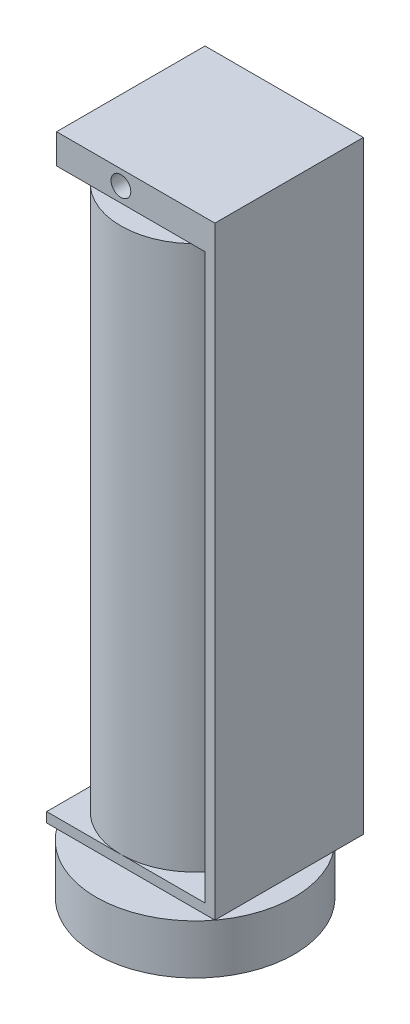
ISO-10303-21;
HEADER;
FILE_DESCRIPTION(('STEP AP214'),'2;1');
FILE_NAME('part.step','',(''),(''),'','','');
FILE_SCHEMA(('AUTOMOTIVE_DESIGN { 1 0 10303 214 1 1 1 1 }'));
ENDSEC;
DATA;
#1=APPLICATION_CONTEXT('core data for automotive mechanical design processes');
#2=APPLICATION_PROTOCOL_DEFINITION('international standard','automotive_design',2000,#1);
#3=PRODUCT_CONTEXT('',#1,'mechanical');
#4=PRODUCT('Part','Part','',(#3));
#5=PRODUCT_RELATED_PRODUCT_CATEGORY('part','',(#4));
#6=PRODUCT_DEFINITION_FORMATION('','',#4);
#7=PRODUCT_DEFINITION_CONTEXT('part definition',#1,'design');
#8=PRODUCT_DEFINITION('design','',#6,#7);
#9=PRODUCT_DEFINITION_SHAPE('','',#8);
#10=(LENGTH_UNIT() NAMED_UNIT(*) SI_UNIT(.MILLI.,.METRE.));
#11=(NAMED_UNIT(*) PLANE_ANGLE_UNIT() SI_UNIT($,.RADIAN.));
#12=(NAMED_UNIT(*) SI_UNIT($,.STERADIAN.) SOLID_ANGLE_UNIT());
#13=UNCERTAINTY_MEASURE_WITH_UNIT(LENGTH_MEASURE(1.E-05),#10,'distance_accuracy_value','');
#14=(GEOMETRIC_REPRESENTATION_CONTEXT(3) GLOBAL_UNCERTAINTY_ASSIGNED_CONTEXT((#13)) GLOBAL_UNIT_ASSIGNED_CONTEXT((#10,
#11,#12)) REPRESENTATION_CONTEXT('',''));
#15=CARTESIAN_POINT('',(0.,0.,0.));
#16=DIRECTION('',(0.,0.,1.));
#17=DIRECTION('',(1.,0.,0.));
#18=AXIS2_PLACEMENT_3D('',#15,#16,#17);
#19=CARTESIAN_POINT('',(17.,135.,-15.));
#20=DIRECTION('',(1.,0.,0.));
#21=DIRECTION('',(0.,0.,-1.));
#22=AXIS2_PLACEMENT_3D('',#19,#20,#21);
#23=PLANE('',#22);
#24=DIRECTION('',(0.,0.,1.));
#25=VECTOR('',#24,1.);
#26=CARTESIAN_POINT('',(17.,129.,-15.));
#27=LINE('',#26,#25);
#28=CARTESIAN_POINT('',(17.,129.,-15.));
#29=VERTEX_POINT('',#28);
#30=CARTESIAN_POINT('',(17.,129.,15.));
#31=VERTEX_POINT('',#30);
#32=EDGE_CURVE('E132',#29,#31,#27,.T.);
#33=ORIENTED_EDGE('',*,*,#32,.F.);
#34=DIRECTION('',(0.,-1.,0.));
#35=VECTOR('',#34,1.);
#36=CARTESIAN_POINT('',(17.,135.,-15.));
#37=LINE('',#36,#35);
#38=CARTESIAN_POINT('',(17.,15.,-15.));
#39=VERTEX_POINT('',#38);
#40=EDGE_CURVE('E138',#29,#39,#37,.T.);
#41=ORIENTED_EDGE('',*,*,#40,.T.);
#42=DIRECTION('',(0.,0.,1.));
#43=VECTOR('',#42,1.);
#44=CARTESIAN_POINT('',(17.,15.,-15.));
#45=LINE('',#44,#43);
#46=CARTESIAN_POINT('',(17.,15.,15.));
#47=VERTEX_POINT('',#46);
#48=EDGE_CURVE('E139',#39,#47,#45,.T.);
#49=ORIENTED_EDGE('',*,*,#48,.T.);
#50=DIRECTION('',(0.,-1.,0.));
#51=VECTOR('',#50,1.);
#52=CARTESIAN_POINT('',(17.,135.,15.));
#53=LINE('',#52,#51);
#54=EDGE_CURVE('E52',#31,#47,#53,.T.);
#55=ORIENTED_EDGE('',*,*,#54,.F.);
#56=EDGE_LOOP('',(#33,#41,#49,#55));
#57=FACE_BOUND('',#56,.T.);
#58=ADVANCED_FACE('F35',(#57),#23,.F.);
#59=CARTESIAN_POINT('',(-15.,15.,-15.));
#60=DIRECTION('',(0.,-1.,0.));
#61=DIRECTION('',(0.,0.,-1.));
#62=AXIS2_PLACEMENT_3D('',#59,#60,#61);
#63=PLANE('',#62);
#64=ORIENTED_EDGE('',*,*,#48,.F.);
#65=DIRECTION('',(1.,0.,0.));
#66=VECTOR('',#65,1.);
#67=CARTESIAN_POINT('',(-15.,15.,-15.));
#68=LINE('',#67,#66);
#69=CARTESIAN_POINT('',(0.,15.,-15.));
#70=VERTEX_POINT('',#69);
#71=EDGE_CURVE('E168',#70,#39,#68,.T.);
#72=ORIENTED_EDGE('',*,*,#71,.F.);
#73=CARTESIAN_POINT('',(0.,15.,0.));
#74=DIRECTION('',(0.,1.,0.));
#75=DIRECTION('',(0.,0.,1.));
#76=AXIS2_PLACEMENT_3D('',#73,#74,#75);
#77=CIRCLE('',#76,15.);
#78=CARTESIAN_POINT('',(0.,15.,15.));
#79=VERTEX_POINT('',#78);
#80=EDGE_CURVE('E185',#79,#70,#77,.T.);
#81=ORIENTED_EDGE('',*,*,#80,.F.);
#82=DIRECTION('',(-1.,0.,0.));
#83=VECTOR('',#82,1.);
#84=CARTESIAN_POINT('',(-15.,15.,15.));
#85=LINE('',#84,#83);
#86=EDGE_CURVE('E160',#47,#79,#85,.T.);
#87=ORIENTED_EDGE('',*,*,#86,.F.);
#88=EDGE_LOOP('',(#64,#72,#81,#87));
#89=FACE_BOUND('',#88,.T.);
#90=ADVANCED_FACE('F209',(#89),#63,.F.);
#91=CARTESIAN_POINT('',(0.,10.,0.));
#92=DIRECTION('',(0.,1.,0.));
#93=DIRECTION('',(0.,0.,1.));
#94=AXIS2_PLACEMENT_3D('',#91,#92,#93);
#95=PLANE('',#94);
#96=CARTESIAN_POINT('',(0.,10.,0.));
#97=DIRECTION('',(0.,1.,0.));
#98=DIRECTION('',(0.,0.,1.));
#99=AXIS2_PLACEMENT_3D('',#96,#97,#98);
#100=CIRCLE('',#99,20.);
#101=CARTESIAN_POINT('',(0.,10.,20.));
#102=VERTEX_POINT('',#101);
#103=EDGE_CURVE('E11',#102,#102,#100,.T.);
#104=ORIENTED_EDGE('',*,*,#103,.T.);
#105=EDGE_LOOP('',(#104));
#106=FACE_BOUND('',#105,.T.);
#107=CARTESIAN_POINT('',(0.,10.,0.));
#108=DIRECTION('',(0.,1.,0.));
#109=DIRECTION('',(0.,0.,1.));
#110=AXIS2_PLACEMENT_3D('',#107,#108,#109);
#111=CIRCLE('',#110,2.);
#112=CARTESIAN_POINT('',(0.,10.,2.));
#113=VERTEX_POINT('',#112);
#114=EDGE_CURVE('E184',#113,#113,#111,.T.);
#115=ORIENTED_EDGE('',*,*,#114,.F.);
#116=EDGE_LOOP('',(#115));
#117=FACE_BOUND('',#116,.T.);
#118=ADVANCED_FACE('F205',(#106,#117),#95,.T.);
#119=CARTESIAN_POINT('',(0.,10.,0.));
#120=DIRECTION('',(0.,-1.,0.));
#121=DIRECTION('',(0.,0.,-1.));
#122=AXIS2_PLACEMENT_3D('',#119,#120,#121);
#123=CYLINDRICAL_SURFACE('',#122,20.);
#124=ORIENTED_EDGE('',*,*,#103,.F.);
#125=EDGE_LOOP('',(#124));
#126=FACE_BOUND('',#125,.T.);
#127=CARTESIAN_POINT('',(0.,0.,0.));
#128=DIRECTION('',(0.,1.,0.));
#129=DIRECTION('',(0.,0.,1.));
#130=AXIS2_PLACEMENT_3D('',#127,#128,#129);
#131=CIRCLE('',#130,20.);
#132=CARTESIAN_POINT('',(0.,0.,20.));
#133=VERTEX_POINT('',#132);
#134=EDGE_CURVE('E44',#133,#133,#131,.T.);
#135=ORIENTED_EDGE('',*,*,#134,.T.);
#136=EDGE_LOOP('',(#135));
#137=FACE_BOUND('',#136,.T.);
#138=ADVANCED_FACE('F37',(#126,#137),#123,.T.);
#139=CARTESIAN_POINT('',(0.,0.,0.));
#140=DIRECTION('',(0.,1.,0.));
#141=DIRECTION('',(0.,0.,1.));
#142=AXIS2_PLACEMENT_3D('',#139,#140,#141);
#143=PLANE('',#142);
#144=ORIENTED_EDGE('',*,*,#134,.F.);
#145=EDGE_LOOP('',(#144));
#146=FACE_BOUND('',#145,.T.);
#147=ADVANCED_FACE('F195',(#146),#143,.F.);
#148=CARTESIAN_POINT('',(0.,15.,0.));
#149=DIRECTION('',(0.,-1.,0.));
#150=DIRECTION('',(0.,0.,-1.));
#151=AXIS2_PLACEMENT_3D('',#148,#149,#150);
#152=CYLINDRICAL_SURFACE('',#151,2.);
#153=CARTESIAN_POINT('',(0.,13.,0.));
#154=DIRECTION('',(0.,-1.,0.));
#155=DIRECTION('',(0.,0.,-1.));
#156=AXIS2_PLACEMENT_3D('',#153,#154,#155);
#157=CIRCLE('',#156,2.);
#158=CARTESIAN_POINT('',(0.,13.,-2.));
#159=VERTEX_POINT('',#158);
#160=EDGE_CURVE('E39',#159,#159,#157,.T.);
#161=ORIENTED_EDGE('',*,*,#160,.T.);
#162=EDGE_LOOP('',(#161));
#163=FACE_BOUND('',#162,.T.);
#164=ORIENTED_EDGE('',*,*,#114,.T.);
#165=EDGE_LOOP('',(#164));
#166=FACE_BOUND('',#165,.T.);
#167=ADVANCED_FACE('F197',(#163,#166),#152,.T.);
#168=CARTESIAN_POINT('',(-15.,13.,-15.));
#169=DIRECTION('',(0.,-1.,0.));
#170=DIRECTION('',(0.,0.,-1.));
#171=AXIS2_PLACEMENT_3D('',#168,#169,#170);
#172=PLANE('',#171);
#173=DIRECTION('',(0.,0.,-1.));
#174=VECTOR('',#173,1.);
#175=CARTESIAN_POINT('',(-15.,13.,15.));
#176=LINE('',#175,#174);
#177=CARTESIAN_POINT('',(-15.,13.,15.));
#178=VERTEX_POINT('',#177);
#179=CARTESIAN_POINT('',(-15.,13.,-15.));
#180=VERTEX_POINT('',#179);
#181=EDGE_CURVE('E156',#178,#180,#176,.T.);
#182=ORIENTED_EDGE('',*,*,#181,.T.);
#183=DIRECTION('',(1.,0.,0.));
#184=VECTOR('',#183,1.);
#185=CARTESIAN_POINT('',(-15.,13.,-15.));
#186=LINE('',#185,#184);
#187=CARTESIAN_POINT('',(19.,13.,-15.));
#188=VERTEX_POINT('',#187);
#189=EDGE_CURVE('E159',#180,#188,#186,.T.);
#190=ORIENTED_EDGE('',*,*,#189,.T.);
#191=DIRECTION('',(0.,0.,1.));
#192=VECTOR('',#191,1.);
#193=CARTESIAN_POINT('',(19.,13.,15.));
#194=LINE('',#193,#192);
#195=CARTESIAN_POINT('',(19.,13.,15.));
#196=VERTEX_POINT('',#195);
#197=EDGE_CURVE('E162',#188,#196,#194,.T.);
#198=ORIENTED_EDGE('',*,*,#197,.T.);
#199=DIRECTION('',(-1.,0.,0.));
#200=VECTOR('',#199,1.);
#201=CARTESIAN_POINT('',(-15.,13.,15.));
#202=LINE('',#201,#200);
#203=EDGE_CURVE('E164',#196,#178,#202,.T.);
#204=ORIENTED_EDGE('',*,*,#203,.T.);
#205=EDGE_LOOP('',(#182,#190,#198,#204));
#206=FACE_BOUND('',#205,.T.);
#207=ORIENTED_EDGE('',*,*,#160,.F.);
#208=EDGE_LOOP('',(#207));
#209=FACE_BOUND('',#208,.T.);
#210=ADVANCED_FACE('F202',(#206,#209),#172,.T.);
#211=CARTESIAN_POINT('',(-15.,15.,15.));
#212=VERTEX_POINT('',#211);
#213=EDGE_CURVE('E171',#79,#212,#85,.T.);
#214=ORIENTED_EDGE('',*,*,#213,.F.);
#215=CARTESIAN_POINT('',(-15.,15.,0.));
#216=VERTEX_POINT('',#215);
#217=EDGE_CURVE('E189',#216,#79,#77,.T.);
#218=ORIENTED_EDGE('',*,*,#217,.F.);
#219=DIRECTION('',(0.,0.,-1.));
#220=VECTOR('',#219,1.);
#221=CARTESIAN_POINT('',(-15.,15.,15.));
#222=LINE('',#221,#220);
#223=EDGE_CURVE('E60',#212,#216,#222,.T.);
#224=ORIENTED_EDGE('',*,*,#223,.F.);
#225=EDGE_LOOP('',(#214,#218,#224));
#226=FACE_BOUND('',#225,.T.);
#227=ADVANCED_FACE('F217',(#226),#63,.F.);
#228=CARTESIAN_POINT('',(-15.,15.,-15.));
#229=VERTEX_POINT('',#228);
#230=EDGE_CURVE('E155',#216,#229,#222,.T.);
#231=ORIENTED_EDGE('',*,*,#230,.F.);
#232=EDGE_CURVE('E188',#70,#216,#77,.T.);
#233=ORIENTED_EDGE('',*,*,#232,.F.);
#234=EDGE_CURVE('E169',#229,#70,#68,.T.);
#235=ORIENTED_EDGE('',*,*,#234,.F.);
#236=EDGE_LOOP('',(#231,#233,#235));
#237=FACE_BOUND('',#236,.T.);
#238=ADVANCED_FACE('F218',(#237),#63,.F.);
#239=CARTESIAN_POINT('',(-15.,13.,15.));
#240=DIRECTION('',(1.,0.,0.));
#241=DIRECTION('',(0.,0.,-1.));
#242=AXIS2_PLACEMENT_3D('',#239,#240,#241);
#243=PLANE('',#242);
#244=ORIENTED_EDGE('',*,*,#223,.T.);
#245=ORIENTED_EDGE('',*,*,#230,.T.);
#246=DIRECTION('',(0.,1.,0.));
#247=VECTOR('',#246,1.);
#248=CARTESIAN_POINT('',(-15.,13.,-15.));
#249=LINE('',#248,#247);
#250=EDGE_CURVE('E178',#180,#229,#249,.T.);
#251=ORIENTED_EDGE('',*,*,#250,.F.);
#252=ORIENTED_EDGE('',*,*,#181,.F.);
#253=DIRECTION('',(0.,1.,0.));
#254=VECTOR('',#253,1.);
#255=CARTESIAN_POINT('',(-15.,13.,15.));
#256=LINE('',#255,#254);
#257=EDGE_CURVE('E166',#178,#212,#256,.T.);
#258=ORIENTED_EDGE('',*,*,#257,.T.);
#259=EDGE_LOOP('',(#244,#245,#251,#252,#258));
#260=FACE_BOUND('',#259,.T.);
#261=ADVANCED_FACE('F237',(#260),#243,.F.);
#262=CARTESIAN_POINT('',(-15.,13.,-15.));
#263=DIRECTION('',(0.,0.,1.));
#264=DIRECTION('',(1.,0.,0.));
#265=AXIS2_PLACEMENT_3D('',#262,#263,#264);
#266=PLANE('',#265);
#267=CARTESIAN_POINT('',(0.0001,132.,-15.));
#268=DIRECTION('',(0.,0.,1.));
#269=DIRECTION('',(1.,0.,0.));
#270=AXIS2_PLACEMENT_3D('',#267,#268,#269);
#271=CIRCLE('',#270,2.);
#272=CARTESIAN_POINT('',(2.0001,132.,-15.));
#273=VERTEX_POINT('',#272);
#274=EDGE_CURVE('E388',#273,#273,#271,.T.);
#275=ORIENTED_EDGE('',*,*,#274,.T.);
#276=EDGE_LOOP('',(#275));
#277=FACE_BOUND('',#276,.T.);
#278=ORIENTED_EDGE('',*,*,#234,.T.);
#279=ORIENTED_EDGE('',*,*,#71,.T.);
#280=ORIENTED_EDGE('',*,*,#40,.F.);
#281=DIRECTION('',(1.,0.,0.));
#282=VECTOR('',#281,1.);
#283=CARTESIAN_POINT('',(-13.,129.,-15.));
#284=LINE('',#283,#282);
#285=CARTESIAN_POINT('',(-13.,129.,-15.));
#286=VERTEX_POINT('',#285);
#287=EDGE_CURVE('E116',#286,#29,#284,.T.);
#288=ORIENTED_EDGE('',*,*,#287,.F.);
#289=DIRECTION('',(0.,-1.,0.));
#290=VECTOR('',#289,1.);
#291=CARTESIAN_POINT('',(-13.,135.,-15.));
#292=LINE('',#291,#290);
#293=CARTESIAN_POINT('',(-13.,135.,-15.));
#294=VERTEX_POINT('',#293);
#295=EDGE_CURVE('E123',#294,#286,#292,.T.);
#296=ORIENTED_EDGE('',*,*,#295,.F.);
#297=DIRECTION('',(-1.,0.,0.));
#298=VECTOR('',#297,1.);
#299=CARTESIAN_POINT('',(17.,135.,-15.));
#300=LINE('',#299,#298);
#301=CARTESIAN_POINT('',(19.,135.,-15.));
#302=VERTEX_POINT('',#301);
#303=EDGE_CURVE('E151',#302,#294,#300,.T.);
#304=ORIENTED_EDGE('',*,*,#303,.F.);
#305=DIRECTION('',(0.,1.,0.));
#306=VECTOR('',#305,1.);
#307=CARTESIAN_POINT('',(19.,13.,-15.));
#308=LINE('',#307,#306);
#309=EDGE_CURVE('E176',#188,#302,#308,.T.);
#310=ORIENTED_EDGE('',*,*,#309,.F.);
#311=ORIENTED_EDGE('',*,*,#189,.F.);
#312=ORIENTED_EDGE('',*,*,#250,.T.);
#313=EDGE_LOOP('',(#278,#279,#280,#288,#296,#304,#310,#311,#312));
#314=FACE_BOUND('',#313,.T.);
#315=ADVANCED_FACE('F136',(#277,#314),#266,.F.);
#316=CARTESIAN_POINT('',(19.,13.,15.));
#317=DIRECTION('',(-1.,0.,0.));
#318=DIRECTION('',(0.,0.,1.));
#319=AXIS2_PLACEMENT_3D('',#316,#317,#318);
#320=PLANE('',#319);
#321=ORIENTED_EDGE('',*,*,#309,.T.);
#322=DIRECTION('',(0.,0.,-1.));
#323=VECTOR('',#322,1.);
#324=CARTESIAN_POINT('',(19.,135.,-15.));
#325=LINE('',#324,#323);
#326=CARTESIAN_POINT('',(19.,135.,15.));
#327=VERTEX_POINT('',#326);
#328=EDGE_CURVE('E148',#327,#302,#325,.T.);
#329=ORIENTED_EDGE('',*,*,#328,.F.);
#330=DIRECTION('',(0.,1.,0.));
#331=VECTOR('',#330,1.);
#332=CARTESIAN_POINT('',(19.,13.,15.));
#333=LINE('',#332,#331);
#334=EDGE_CURVE('E174',#196,#327,#333,.T.);
#335=ORIENTED_EDGE('',*,*,#334,.F.);
#336=ORIENTED_EDGE('',*,*,#197,.F.);
#337=EDGE_LOOP('',(#321,#329,#335,#336));
#338=FACE_BOUND('',#337,.T.);
#339=ADVANCED_FACE('F230',(#338),#320,.F.);
#340=CARTESIAN_POINT('',(-15.,13.,15.));
#341=DIRECTION('',(0.,0.,-1.));
#342=DIRECTION('',(-1.,0.,0.));
#343=AXIS2_PLACEMENT_3D('',#340,#341,#342);
#344=PLANE('',#343);
#345=CARTESIAN_POINT('',(0.0001,132.,15.));
#346=DIRECTION('',(0.,0.,1.));
#347=DIRECTION('',(1.,0.,0.));
#348=AXIS2_PLACEMENT_3D('',#345,#346,#347);
#349=CIRCLE('',#348,2.);
#350=CARTESIAN_POINT('',(2.0001,132.,15.));
#351=VERTEX_POINT('',#350);
#352=EDGE_CURVE('E391',#351,#351,#349,.T.);
#353=ORIENTED_EDGE('',*,*,#352,.F.);
#354=EDGE_LOOP('',(#353));
#355=FACE_BOUND('',#354,.T.);
#356=ORIENTED_EDGE('',*,*,#334,.T.);
#357=DIRECTION('',(1.,0.,0.));
#358=VECTOR('',#357,1.);
#359=CARTESIAN_POINT('',(17.,135.,15.));
#360=LINE('',#359,#358);
#361=CARTESIAN_POINT('',(-13.,135.,15.));
#362=VERTEX_POINT('',#361);
#363=EDGE_CURVE('E141',#362,#327,#360,.T.);
#364=ORIENTED_EDGE('',*,*,#363,.F.);
#365=DIRECTION('',(0.,1.,0.));
#366=VECTOR('',#365,1.);
#367=CARTESIAN_POINT('',(-13.,135.,15.));
#368=LINE('',#367,#366);
#369=CARTESIAN_POINT('',(-13.,129.,15.));
#370=VERTEX_POINT('',#369);
#371=EDGE_CURVE('E122',#370,#362,#368,.T.);
#372=ORIENTED_EDGE('',*,*,#371,.F.);
#373=DIRECTION('',(1.,0.,0.));
#374=VECTOR('',#373,1.);
#375=CARTESIAN_POINT('',(-13.,129.,15.));
#376=LINE('',#375,#374);
#377=EDGE_CURVE('E118',#370,#31,#376,.T.);
#378=ORIENTED_EDGE('',*,*,#377,.T.);
#379=ORIENTED_EDGE('',*,*,#54,.T.);
#380=ORIENTED_EDGE('',*,*,#86,.T.);
#381=ORIENTED_EDGE('',*,*,#213,.T.);
#382=ORIENTED_EDGE('',*,*,#257,.F.);
#383=ORIENTED_EDGE('',*,*,#203,.F.);
#384=EDGE_LOOP('',(#356,#364,#372,#378,#379,#380,#381,#382,#383));
#385=FACE_BOUND('',#384,.T.);
#386=ADVANCED_FACE('F226',(#355,#385),#344,.F.);
#387=CARTESIAN_POINT('',(0.,125.,0.));
#388=DIRECTION('',(0.,1.,0.));
#389=DIRECTION('',(0.,0.,1.));
#390=AXIS2_PLACEMENT_3D('',#387,#388,#389);
#391=PLANE('',#390);
#392=CARTESIAN_POINT('',(0.,125.,0.));
#393=DIRECTION('',(0.,1.,0.));
#394=DIRECTION('',(0.,0.,1.));
#395=AXIS2_PLACEMENT_3D('',#392,#393,#394);
#396=CIRCLE('',#395,15.);
#397=CARTESIAN_POINT('',(0.,125.,15.));
#398=VERTEX_POINT('',#397);
#399=EDGE_CURVE('E181',#398,#398,#396,.T.);
#400=ORIENTED_EDGE('',*,*,#399,.T.);
#401=EDGE_LOOP('',(#400));
#402=FACE_BOUND('',#401,.T.);
#403=ADVANCED_FACE('F229',(#402),#391,.T.);
#404=CARTESIAN_POINT('',(0.,125.,0.));
#405=DIRECTION('',(0.,-1.,0.));
#406=DIRECTION('',(0.,0.,-1.));
#407=AXIS2_PLACEMENT_3D('',#404,#405,#406);
#408=CYLINDRICAL_SURFACE('',#407,15.);
#409=ORIENTED_EDGE('',*,*,#399,.F.);
#410=EDGE_LOOP('',(#409));
#411=FACE_BOUND('',#410,.T.);
#412=ORIENTED_EDGE('',*,*,#80,.T.);
#413=ORIENTED_EDGE('',*,*,#232,.T.);
#414=ORIENTED_EDGE('',*,*,#217,.T.);
#415=EDGE_LOOP('',(#412,#413,#414));
#416=FACE_BOUND('',#415,.T.);
#417=ADVANCED_FACE('F243',(#411,#416),#408,.T.);
#418=CARTESIAN_POINT('',(17.,135.,15.));
#419=DIRECTION('',(0.,1.,0.));
#420=DIRECTION('',(0.,0.,1.));
#421=AXIS2_PLACEMENT_3D('',#418,#419,#420);
#422=PLANE('',#421);
#423=ORIENTED_EDGE('',*,*,#303,.T.);
#424=DIRECTION('',(0.,0.,-1.));
#425=VECTOR('',#424,1.);
#426=CARTESIAN_POINT('',(-13.,135.,-15.));
#427=LINE('',#426,#425);
#428=EDGE_CURVE('E129',#362,#294,#427,.T.);
#429=ORIENTED_EDGE('',*,*,#428,.F.);
#430=ORIENTED_EDGE('',*,*,#363,.T.);
#431=ORIENTED_EDGE('',*,*,#328,.T.);
#432=EDGE_LOOP('',(#423,#429,#430,#431));
#433=FACE_BOUND('',#432,.T.);
#434=ADVANCED_FACE('F221',(#433),#422,.T.);
#435=CARTESIAN_POINT('',(-13.,129.,-15.));
#436=DIRECTION('',(0.,1.,0.));
#437=DIRECTION('',(0.,0.,1.));
#438=AXIS2_PLACEMENT_3D('',#435,#436,#437);
#439=PLANE('',#438);
#440=ORIENTED_EDGE('',*,*,#32,.T.);
#441=ORIENTED_EDGE('',*,*,#377,.F.);
#442=DIRECTION('',(0.,0.,1.));
#443=VECTOR('',#442,1.);
#444=CARTESIAN_POINT('',(-13.,129.,-15.));
#445=LINE('',#444,#443);
#446=EDGE_CURVE('E112',#286,#370,#445,.T.);
#447=ORIENTED_EDGE('',*,*,#446,.F.);
#448=ORIENTED_EDGE('',*,*,#287,.T.);
#449=EDGE_LOOP('',(#440,#441,#447,#448));
#450=FACE_BOUND('',#449,.T.);
#451=ADVANCED_FACE('F114',(#450),#439,.F.);
#452=CARTESIAN_POINT('',(-13.,129.,-15.));
#453=DIRECTION('',(-1.,0.,0.));
#454=DIRECTION('',(0.,0.,1.));
#455=AXIS2_PLACEMENT_3D('',#452,#453,#454);
#456=PLANE('',#455);
#457=ORIENTED_EDGE('',*,*,#295,.T.);
#458=ORIENTED_EDGE('',*,*,#446,.T.);
#459=ORIENTED_EDGE('',*,*,#371,.T.);
#460=ORIENTED_EDGE('',*,*,#428,.T.);
#461=EDGE_LOOP('',(#457,#458,#459,#460));
#462=FACE_BOUND('',#461,.T.);
#463=ADVANCED_FACE('F127',(#462),#456,.T.);
#464=CARTESIAN_POINT('',(0.0001,132.,-15.));
#465=DIRECTION('',(0.,0.,1.));
#466=DIRECTION('',(1.,0.,0.));
#467=AXIS2_PLACEMENT_3D('',#464,#465,#466);
#468=CYLINDRICAL_SURFACE('',#467,2.);
#469=ORIENTED_EDGE('',*,*,#274,.F.);
#470=EDGE_LOOP('',(#469));
#471=FACE_BOUND('',#470,.T.);
#472=ORIENTED_EDGE('',*,*,#352,.T.);
#473=EDGE_LOOP('',(#472));
#474=FACE_BOUND('',#473,.T.);
#475=ADVANCED_FACE('F362',(#471,#474),#468,.F.);
#476=CLOSED_SHELL('',(#58,#90,#118,#138,#147,#167,#210,#227,#238,#261,#315,#339,#386,#403,#417,
#434,#451,#463,#475));
#477=MANIFOLD_SOLID_BREP('B2',#476);
#478=ADVANCED_BREP_SHAPE_REPRESENTATION('',(#18,#477),#14);
#479=SHAPE_DEFINITION_REPRESENTATION(#9,#478);
ENDSEC;
END-ISO-10303-21;
